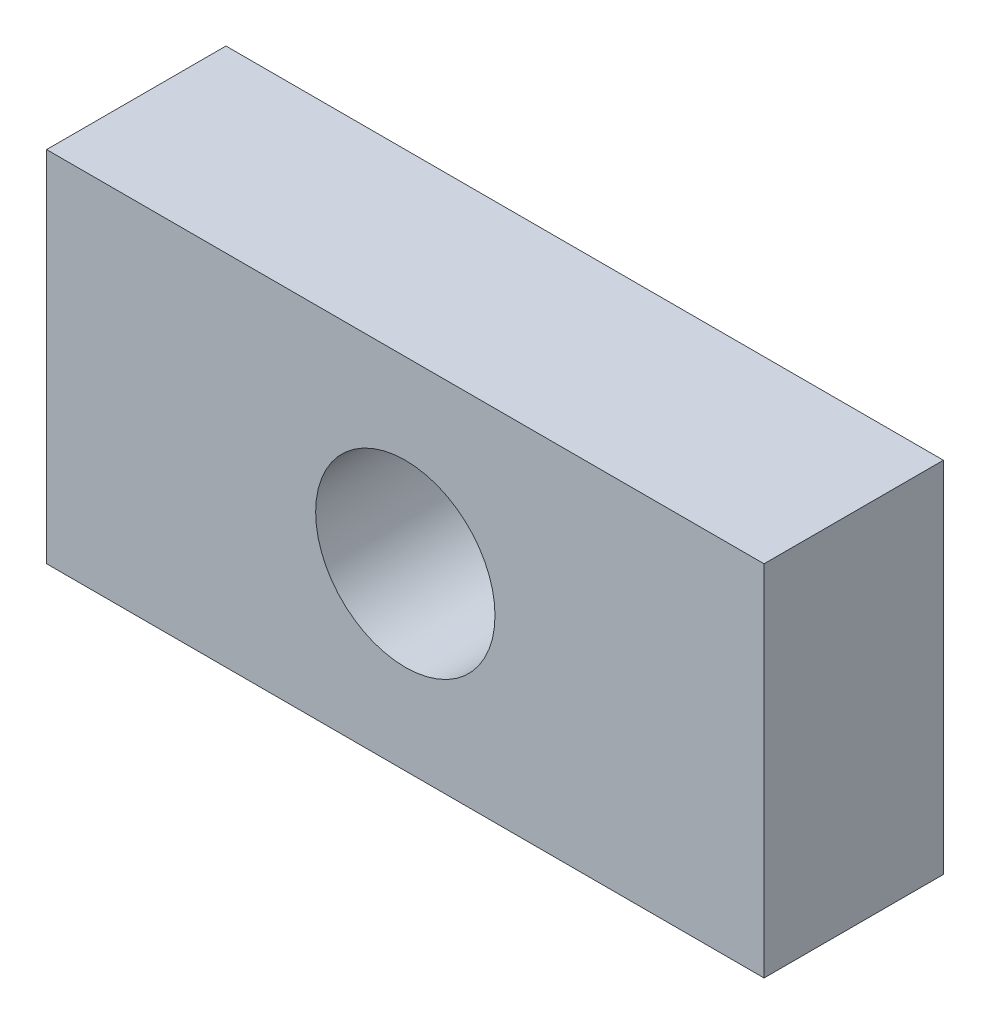
ISO-10303-21;
HEADER;
FILE_DESCRIPTION(('STEP AP214'),'2;1');
FILE_NAME('part.step','',(''),(''),'','','');
FILE_SCHEMA(('AUTOMOTIVE_DESIGN { 1 0 10303 214 1 1 1 1 }'));
ENDSEC;
DATA;
#1=APPLICATION_CONTEXT('core data for automotive mechanical design processes');
#2=APPLICATION_PROTOCOL_DEFINITION('international standard','automotive_design',2000,#1);
#3=PRODUCT_CONTEXT('',#1,'mechanical');
#4=PRODUCT('Part','Part','',(#3));
#5=PRODUCT_RELATED_PRODUCT_CATEGORY('part','',(#4));
#6=PRODUCT_DEFINITION_FORMATION('','',#4);
#7=PRODUCT_DEFINITION_CONTEXT('part definition',#1,'design');
#8=PRODUCT_DEFINITION('design','',#6,#7);
#9=PRODUCT_DEFINITION_SHAPE('','',#8);
#10=(LENGTH_UNIT() NAMED_UNIT(*) SI_UNIT(.MILLI.,.METRE.));
#11=(NAMED_UNIT(*) PLANE_ANGLE_UNIT() SI_UNIT($,.RADIAN.));
#12=(NAMED_UNIT(*) SI_UNIT($,.STERADIAN.) SOLID_ANGLE_UNIT());
#13=UNCERTAINTY_MEASURE_WITH_UNIT(LENGTH_MEASURE(1.E-05),#10,'distance_accuracy_value','');
#14=(GEOMETRIC_REPRESENTATION_CONTEXT(3) GLOBAL_UNCERTAINTY_ASSIGNED_CONTEXT((#13)) GLOBAL_UNIT_ASSIGNED_CONTEXT((#10,
#11,#12)) REPRESENTATION_CONTEXT('',''));
#15=CARTESIAN_POINT('',(0.,0.,0.));
#16=DIRECTION('',(0.,0.,1.));
#17=DIRECTION('',(1.,0.,0.));
#18=AXIS2_PLACEMENT_3D('',#15,#16,#17);
#19=CARTESIAN_POINT('',(100.,50.,50.));
#20=DIRECTION('',(0.,-1.,0.));
#21=DIRECTION('',(1.,0.,0.));
#22=AXIS2_PLACEMENT_3D('',#19,#20,#21);
#23=PLANE('',#22);
#24=DIRECTION('',(-1.,0.,0.));
#25=VECTOR('',#24,1.);
#26=CARTESIAN_POINT('',(100.,50.,0.));
#27=LINE('',#26,#25);
#28=CARTESIAN_POINT('',(100.,50.,0.));
#29=VERTEX_POINT('',#28);
#30=CARTESIAN_POINT('',(-100.,50.,0.));
#31=VERTEX_POINT('',#30);
#32=EDGE_CURVE('E115',#29,#31,#27,.T.);
#33=ORIENTED_EDGE('',*,*,#32,.T.);
#34=DIRECTION('',(0.,0.,-1.));
#35=VECTOR('',#34,1.);
#36=CARTESIAN_POINT('',(-100.,50.,50.));
#37=LINE('',#36,#35);
#38=CARTESIAN_POINT('',(-100.,50.,50.));
#39=VERTEX_POINT('',#38);
#40=EDGE_CURVE('E11',#39,#31,#37,.T.);
#41=ORIENTED_EDGE('',*,*,#40,.F.);
#42=DIRECTION('',(-1.,0.,0.));
#43=VECTOR('',#42,1.);
#44=CARTESIAN_POINT('',(100.,50.,50.));
#45=LINE('',#44,#43);
#46=CARTESIAN_POINT('',(100.,50.,50.));
#47=VERTEX_POINT('',#46);
#48=EDGE_CURVE('E98',#47,#39,#45,.T.);
#49=ORIENTED_EDGE('',*,*,#48,.F.);
#50=DIRECTION('',(0.,0.,-1.));
#51=VECTOR('',#50,1.);
#52=CARTESIAN_POINT('',(100.,50.,50.));
#53=LINE('',#52,#51);
#54=EDGE_CURVE('E111',#47,#29,#53,.T.);
#55=ORIENTED_EDGE('',*,*,#54,.T.);
#56=EDGE_LOOP('',(#33,#41,#49,#55));
#57=FACE_BOUND('',#56,.T.);
#58=ADVANCED_FACE('F45',(#57),#23,.F.);
#59=CARTESIAN_POINT('',(-100.,50.,50.));
#60=DIRECTION('',(1.,0.,0.));
#61=DIRECTION('',(0.,1.,0.));
#62=AXIS2_PLACEMENT_3D('',#59,#60,#61);
#63=PLANE('',#62);
#64=DIRECTION('',(0.,-1.,0.));
#65=VECTOR('',#64,1.);
#66=CARTESIAN_POINT('',(-100.,50.,0.));
#67=LINE('',#66,#65);
#68=CARTESIAN_POINT('',(-100.,-50.,0.));
#69=VERTEX_POINT('',#68);
#70=EDGE_CURVE('E103',#31,#69,#67,.T.);
#71=ORIENTED_EDGE('',*,*,#70,.T.);
#72=DIRECTION('',(0.,0.,-1.));
#73=VECTOR('',#72,1.);
#74=CARTESIAN_POINT('',(-100.,-50.,50.));
#75=LINE('',#74,#73);
#76=CARTESIAN_POINT('',(-100.,-50.,50.));
#77=VERTEX_POINT('',#76);
#78=EDGE_CURVE('E55',#77,#69,#75,.T.);
#79=ORIENTED_EDGE('',*,*,#78,.F.);
#80=DIRECTION('',(0.,-1.,0.));
#81=VECTOR('',#80,1.);
#82=CARTESIAN_POINT('',(-100.,50.,50.));
#83=LINE('',#82,#81);
#84=EDGE_CURVE('E93',#39,#77,#83,.T.);
#85=ORIENTED_EDGE('',*,*,#84,.F.);
#86=ORIENTED_EDGE('',*,*,#40,.T.);
#87=EDGE_LOOP('',(#71,#79,#85,#86));
#88=FACE_BOUND('',#87,.T.);
#89=ADVANCED_FACE('F102',(#88),#63,.F.);
#90=CARTESIAN_POINT('',(-100.,-50.,50.));
#91=DIRECTION('',(0.,1.,0.));
#92=DIRECTION('',(0.,0.,1.));
#93=AXIS2_PLACEMENT_3D('',#90,#91,#92);
#94=PLANE('',#93);
#95=DIRECTION('',(1.,0.,0.));
#96=VECTOR('',#95,1.);
#97=CARTESIAN_POINT('',(-100.,-50.,0.));
#98=LINE('',#97,#96);
#99=CARTESIAN_POINT('',(100.,-50.,0.));
#100=VERTEX_POINT('',#99);
#101=EDGE_CURVE('E80',#69,#100,#98,.T.);
#102=ORIENTED_EDGE('',*,*,#101,.T.);
#103=DIRECTION('',(0.,0.,-1.));
#104=VECTOR('',#103,1.);
#105=CARTESIAN_POINT('',(100.,-50.,50.));
#106=LINE('',#105,#104);
#107=CARTESIAN_POINT('',(100.,-50.,50.));
#108=VERTEX_POINT('',#107);
#109=EDGE_CURVE('E105',#108,#100,#106,.T.);
#110=ORIENTED_EDGE('',*,*,#109,.F.);
#111=DIRECTION('',(1.,0.,0.));
#112=VECTOR('',#111,1.);
#113=CARTESIAN_POINT('',(-100.,-50.,50.));
#114=LINE('',#113,#112);
#115=EDGE_CURVE('E96',#77,#108,#114,.T.);
#116=ORIENTED_EDGE('',*,*,#115,.F.);
#117=ORIENTED_EDGE('',*,*,#78,.T.);
#118=EDGE_LOOP('',(#102,#110,#116,#117));
#119=FACE_BOUND('',#118,.T.);
#120=ADVANCED_FACE('F107',(#119),#94,.F.);
#121=CARTESIAN_POINT('',(100.,-50.,50.));
#122=DIRECTION('',(-1.,0.,0.));
#123=DIRECTION('',(0.,0.,1.));
#124=AXIS2_PLACEMENT_3D('',#121,#122,#123);
#125=PLANE('',#124);
#126=DIRECTION('',(0.,1.,0.));
#127=VECTOR('',#126,1.);
#128=CARTESIAN_POINT('',(100.,-50.,0.));
#129=LINE('',#128,#127);
#130=EDGE_CURVE('E86',#100,#29,#129,.T.);
#131=ORIENTED_EDGE('',*,*,#130,.T.);
#132=ORIENTED_EDGE('',*,*,#54,.F.);
#133=DIRECTION('',(0.,1.,0.));
#134=VECTOR('',#133,1.);
#135=CARTESIAN_POINT('',(100.,-50.,50.));
#136=LINE('',#135,#134);
#137=EDGE_CURVE('E63',#108,#47,#136,.T.);
#138=ORIENTED_EDGE('',*,*,#137,.F.);
#139=ORIENTED_EDGE('',*,*,#109,.T.);
#140=EDGE_LOOP('',(#131,#132,#138,#139));
#141=FACE_BOUND('',#140,.T.);
#142=ADVANCED_FACE('F128',(#141),#125,.F.);
#143=CARTESIAN_POINT('',(0.,0.,50.));
#144=DIRECTION('',(0.,0.,1.));
#145=DIRECTION('',(1.,0.,0.));
#146=AXIS2_PLACEMENT_3D('',#143,#144,#145);
#147=PLANE('',#146);
#148=CARTESIAN_POINT('',(0.,0.,50.));
#149=DIRECTION('',(0.,0.,1.));
#150=DIRECTION('',(1.,0.,0.));
#151=AXIS2_PLACEMENT_3D('',#148,#149,#150);
#152=CIRCLE('',#151,25.);
#153=CARTESIAN_POINT('',(25.,0.,50.));
#154=VERTEX_POINT('',#153);
#155=EDGE_CURVE('E135',#154,#154,#152,.T.);
#156=ORIENTED_EDGE('',*,*,#155,.F.);
#157=EDGE_LOOP('',(#156));
#158=FACE_BOUND('',#157,.T.);
#159=ORIENTED_EDGE('',*,*,#48,.T.);
#160=ORIENTED_EDGE('',*,*,#84,.T.);
#161=ORIENTED_EDGE('',*,*,#115,.T.);
#162=ORIENTED_EDGE('',*,*,#137,.T.);
#163=EDGE_LOOP('',(#159,#160,#161,#162));
#164=FACE_BOUND('',#163,.T.);
#165=ADVANCED_FACE('F94',(#158,#164),#147,.T.);
#166=CARTESIAN_POINT('',(0.,0.,0.));
#167=DIRECTION('',(0.,0.,1.));
#168=DIRECTION('',(1.,0.,0.));
#169=AXIS2_PLACEMENT_3D('',#166,#167,#168);
#170=PLANE('',#169);
#171=CARTESIAN_POINT('',(0.,0.,0.));
#172=DIRECTION('',(0.,0.,1.));
#173=DIRECTION('',(1.,0.,0.));
#174=AXIS2_PLACEMENT_3D('',#171,#172,#173);
#175=CIRCLE('',#174,25.);
#176=CARTESIAN_POINT('',(25.,0.,0.));
#177=VERTEX_POINT('',#176);
#178=EDGE_CURVE('E48',#177,#177,#175,.F.);
#179=ORIENTED_EDGE('',*,*,#178,.F.);
#180=EDGE_LOOP('',(#179));
#181=FACE_BOUND('',#180,.T.);
#182=ORIENTED_EDGE('',*,*,#32,.F.);
#183=ORIENTED_EDGE('',*,*,#130,.F.);
#184=ORIENTED_EDGE('',*,*,#101,.F.);
#185=ORIENTED_EDGE('',*,*,#70,.F.);
#186=EDGE_LOOP('',(#182,#183,#184,#185));
#187=FACE_BOUND('',#186,.T.);
#188=ADVANCED_FACE('F131',(#181,#187),#170,.F.);
#189=CARTESIAN_POINT('',(0.,0.,50.));
#190=DIRECTION('',(0.,0.,-1.));
#191=DIRECTION('',(-1.,0.,0.));
#192=AXIS2_PLACEMENT_3D('',#189,#190,#191);
#193=CYLINDRICAL_SURFACE('',#192,25.);
#194=ORIENTED_EDGE('',*,*,#155,.T.);
#195=EDGE_LOOP('',(#194));
#196=FACE_BOUND('',#195,.T.);
#197=ORIENTED_EDGE('',*,*,#178,.T.);
#198=EDGE_LOOP('',(#197));
#199=FACE_BOUND('',#198,.T.);
#200=ADVANCED_FACE('F144',(#196,#199),#193,.F.);
#201=CLOSED_SHELL('',(#58,#89,#120,#142,#165,#188,#200));
#202=MANIFOLD_SOLID_BREP('B2',#201);
#203=ADVANCED_BREP_SHAPE_REPRESENTATION('',(#18,#202),#14);
#204=SHAPE_DEFINITION_REPRESENTATION(#9,#203);
ENDSEC;
END-ISO-10303-21;
